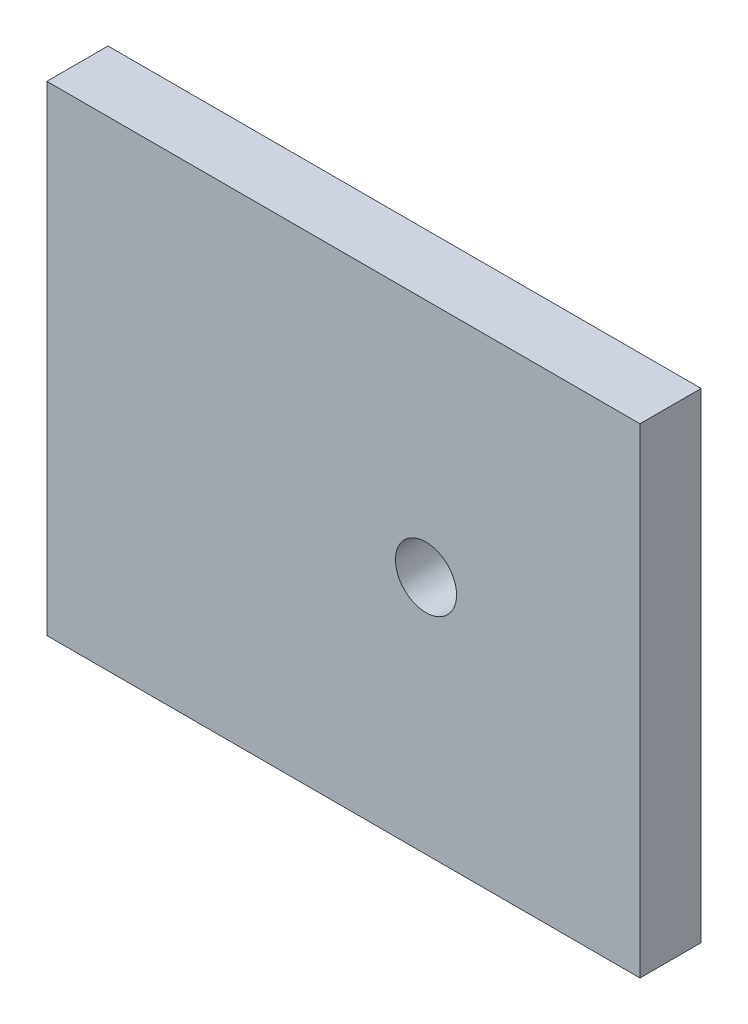
ISO-10303-21;
HEADER;
FILE_DESCRIPTION(('STEP AP214'),'2;1');
FILE_NAME('part.step','',(''),(''),'','','');
FILE_SCHEMA(('AUTOMOTIVE_DESIGN { 1 0 10303 214 1 1 1 1 }'));
ENDSEC;
DATA;
#1=APPLICATION_CONTEXT('core data for automotive mechanical design processes');
#2=APPLICATION_PROTOCOL_DEFINITION('international standard','automotive_design',2000,#1);
#3=PRODUCT_CONTEXT('',#1,'mechanical');
#4=PRODUCT('Part','Part','',(#3));
#5=PRODUCT_RELATED_PRODUCT_CATEGORY('part','',(#4));
#6=PRODUCT_DEFINITION_FORMATION('','',#4);
#7=PRODUCT_DEFINITION_CONTEXT('part definition',#1,'design');
#8=PRODUCT_DEFINITION('design','',#6,#7);
#9=PRODUCT_DEFINITION_SHAPE('','',#8);
#10=(LENGTH_UNIT() NAMED_UNIT(*) SI_UNIT(.MILLI.,.METRE.));
#11=(NAMED_UNIT(*) PLANE_ANGLE_UNIT() SI_UNIT($,.RADIAN.));
#12=(NAMED_UNIT(*) SI_UNIT($,.STERADIAN.) SOLID_ANGLE_UNIT());
#13=UNCERTAINTY_MEASURE_WITH_UNIT(LENGTH_MEASURE(1.E-05),#10,'distance_accuracy_value','');
#14=(GEOMETRIC_REPRESENTATION_CONTEXT(3) GLOBAL_UNCERTAINTY_ASSIGNED_CONTEXT((#13)) GLOBAL_UNIT_ASSIGNED_CONTEXT((#10,
#11,#12)) REPRESENTATION_CONTEXT('',''));
#15=CARTESIAN_POINT('',(0.,0.,0.));
#16=DIRECTION('',(0.,0.,1.));
#17=DIRECTION('',(1.,0.,0.));
#18=AXIS2_PLACEMENT_3D('',#15,#16,#17);
#19=CARTESIAN_POINT('',(48.5,-39.25,10.));
#20=DIRECTION('',(-1.,0.,0.));
#21=DIRECTION('',(0.,0.,1.));
#22=AXIS2_PLACEMENT_3D('',#19,#20,#21);
#23=PLANE('',#22);
#24=DIRECTION('',(0.,1.,0.));
#25=VECTOR('',#24,1.);
#26=CARTESIAN_POINT('',(48.5,-39.25,0.));
#27=LINE('',#26,#25);
#28=CARTESIAN_POINT('',(48.5,-39.25,0.));
#29=VERTEX_POINT('',#28);
#30=CARTESIAN_POINT('',(48.5,39.25,0.));
#31=VERTEX_POINT('',#30);
#32=EDGE_CURVE('E107',#29,#31,#27,.T.);
#33=ORIENTED_EDGE('',*,*,#32,.T.);
#34=DIRECTION('',(0.,0.,-1.));
#35=VECTOR('',#34,1.);
#36=CARTESIAN_POINT('',(48.5,39.25,10.));
#37=LINE('',#36,#35);
#38=CARTESIAN_POINT('',(48.5,39.25,10.));
#39=VERTEX_POINT('',#38);
#40=EDGE_CURVE('E11',#39,#31,#37,.T.);
#41=ORIENTED_EDGE('',*,*,#40,.F.);
#42=DIRECTION('',(0.,1.,0.));
#43=VECTOR('',#42,1.);
#44=CARTESIAN_POINT('',(48.5,-39.25,10.));
#45=LINE('',#44,#43);
#46=CARTESIAN_POINT('',(48.5,-39.25,10.));
#47=VERTEX_POINT('',#46);
#48=EDGE_CURVE('E91',#47,#39,#45,.T.);
#49=ORIENTED_EDGE('',*,*,#48,.F.);
#50=DIRECTION('',(0.,0.,-1.));
#51=VECTOR('',#50,1.);
#52=CARTESIAN_POINT('',(48.5,-39.25,10.));
#53=LINE('',#52,#51);
#54=EDGE_CURVE('E103',#47,#29,#53,.T.);
#55=ORIENTED_EDGE('',*,*,#54,.T.);
#56=EDGE_LOOP('',(#33,#41,#49,#55));
#57=FACE_BOUND('',#56,.T.);
#58=ADVANCED_FACE('F39',(#57),#23,.F.);
#59=CARTESIAN_POINT('',(-48.5,39.25,10.));
#60=DIRECTION('',(0.,-1.,0.));
#61=DIRECTION('',(0.,0.,-1.));
#62=AXIS2_PLACEMENT_3D('',#59,#60,#61);
#63=PLANE('',#62);
#64=DIRECTION('',(-1.,0.,0.));
#65=VECTOR('',#64,1.);
#66=CARTESIAN_POINT('',(-48.5,39.25,0.));
#67=LINE('',#66,#65);
#68=CARTESIAN_POINT('',(-48.5,39.25,0.));
#69=VERTEX_POINT('',#68);
#70=EDGE_CURVE('E96',#31,#69,#67,.T.);
#71=ORIENTED_EDGE('',*,*,#70,.T.);
#72=DIRECTION('',(0.,0.,-1.));
#73=VECTOR('',#72,1.);
#74=CARTESIAN_POINT('',(-48.5,39.25,10.));
#75=LINE('',#74,#73);
#76=CARTESIAN_POINT('',(-48.5,39.25,10.));
#77=VERTEX_POINT('',#76);
#78=EDGE_CURVE('E48',#77,#69,#75,.T.);
#79=ORIENTED_EDGE('',*,*,#78,.F.);
#80=DIRECTION('',(-1.,0.,0.));
#81=VECTOR('',#80,1.);
#82=CARTESIAN_POINT('',(-48.5,39.25,10.));
#83=LINE('',#82,#81);
#84=EDGE_CURVE('E86',#39,#77,#83,.T.);
#85=ORIENTED_EDGE('',*,*,#84,.F.);
#86=ORIENTED_EDGE('',*,*,#40,.T.);
#87=EDGE_LOOP('',(#71,#79,#85,#86));
#88=FACE_BOUND('',#87,.T.);
#89=ADVANCED_FACE('F95',(#88),#63,.F.);
#90=CARTESIAN_POINT('',(-48.5,-39.25,10.));
#91=DIRECTION('',(1.,0.,0.));
#92=DIRECTION('',(0.,0.,-1.));
#93=AXIS2_PLACEMENT_3D('',#90,#91,#92);
#94=PLANE('',#93);
#95=DIRECTION('',(0.,-1.,0.));
#96=VECTOR('',#95,1.);
#97=CARTESIAN_POINT('',(-48.5,-39.25,0.));
#98=LINE('',#97,#96);
#99=CARTESIAN_POINT('',(-48.5,-39.25,0.));
#100=VERTEX_POINT('',#99);
#101=EDGE_CURVE('E73',#69,#100,#98,.T.);
#102=ORIENTED_EDGE('',*,*,#101,.T.);
#103=DIRECTION('',(0.,0.,-1.));
#104=VECTOR('',#103,1.);
#105=CARTESIAN_POINT('',(-48.5,-39.25,10.));
#106=LINE('',#105,#104);
#107=CARTESIAN_POINT('',(-48.5,-39.25,10.));
#108=VERTEX_POINT('',#107);
#109=EDGE_CURVE('E98',#108,#100,#106,.T.);
#110=ORIENTED_EDGE('',*,*,#109,.F.);
#111=DIRECTION('',(0.,-1.,0.));
#112=VECTOR('',#111,1.);
#113=CARTESIAN_POINT('',(-48.5,-39.25,10.));
#114=LINE('',#113,#112);
#115=EDGE_CURVE('E89',#77,#108,#114,.T.);
#116=ORIENTED_EDGE('',*,*,#115,.F.);
#117=ORIENTED_EDGE('',*,*,#78,.T.);
#118=EDGE_LOOP('',(#102,#110,#116,#117));
#119=FACE_BOUND('',#118,.T.);
#120=ADVANCED_FACE('F99',(#119),#94,.F.);
#121=CARTESIAN_POINT('',(-48.5,-39.25,10.));
#122=DIRECTION('',(0.,1.,0.));
#123=DIRECTION('',(0.,0.,1.));
#124=AXIS2_PLACEMENT_3D('',#121,#122,#123);
#125=PLANE('',#124);
#126=DIRECTION('',(1.,0.,0.));
#127=VECTOR('',#126,1.);
#128=CARTESIAN_POINT('',(-48.5,-39.25,0.));
#129=LINE('',#128,#127);
#130=EDGE_CURVE('E79',#100,#29,#129,.T.);
#131=ORIENTED_EDGE('',*,*,#130,.T.);
#132=ORIENTED_EDGE('',*,*,#54,.F.);
#133=DIRECTION('',(1.,0.,0.));
#134=VECTOR('',#133,1.);
#135=CARTESIAN_POINT('',(-48.5,-39.25,10.));
#136=LINE('',#135,#134);
#137=EDGE_CURVE('E56',#108,#47,#136,.T.);
#138=ORIENTED_EDGE('',*,*,#137,.F.);
#139=ORIENTED_EDGE('',*,*,#109,.T.);
#140=EDGE_LOOP('',(#131,#132,#138,#139));
#141=FACE_BOUND('',#140,.T.);
#142=ADVANCED_FACE('F121',(#141),#125,.F.);
#143=CARTESIAN_POINT('',(0.,0.,10.));
#144=DIRECTION('',(0.,0.,-1.));
#145=DIRECTION('',(-1.,0.,0.));
#146=AXIS2_PLACEMENT_3D('',#143,#144,#145);
#147=PLANE('',#146);
#148=CARTESIAN_POINT('',(13.5,0.,10.));
#149=DIRECTION('',(0.,0.,1.));
#150=DIRECTION('',(1.,0.,0.));
#151=AXIS2_PLACEMENT_3D('',#148,#149,#150);
#152=CIRCLE('',#151,5.);
#153=CARTESIAN_POINT('',(18.5,0.,10.));
#154=VERTEX_POINT('',#153);
#155=EDGE_CURVE('E111',#154,#154,#152,.T.);
#156=ORIENTED_EDGE('',*,*,#155,.F.);
#157=EDGE_LOOP('',(#156));
#158=FACE_BOUND('',#157,.T.);
#159=ORIENTED_EDGE('',*,*,#48,.T.);
#160=ORIENTED_EDGE('',*,*,#84,.T.);
#161=ORIENTED_EDGE('',*,*,#115,.T.);
#162=ORIENTED_EDGE('',*,*,#137,.T.);
#163=EDGE_LOOP('',(#159,#160,#161,#162));
#164=FACE_BOUND('',#163,.T.);
#165=ADVANCED_FACE('F87',(#158,#164),#147,.F.);
#166=CARTESIAN_POINT('',(0.,0.,0.));
#167=DIRECTION('',(0.,0.,-1.));
#168=DIRECTION('',(-1.,0.,0.));
#169=AXIS2_PLACEMENT_3D('',#166,#167,#168);
#170=PLANE('',#169);
#171=CARTESIAN_POINT('',(-24.25,0.,0.));
#172=DIRECTION('',(0.,0.,-1.));
#173=DIRECTION('',(-1.,0.,0.));
#174=AXIS2_PLACEMENT_3D('',#171,#172,#173);
#175=CIRCLE('',#174,11.);
#176=CARTESIAN_POINT('',(-35.25,0.,0.));
#177=VERTEX_POINT('',#176);
#178=EDGE_CURVE('E136',#177,#177,#175,.T.);
#179=ORIENTED_EDGE('',*,*,#178,.F.);
#180=EDGE_LOOP('',(#179));
#181=FACE_BOUND('',#180,.T.);
#182=CARTESIAN_POINT('',(13.5,0.,0.));
#183=DIRECTION('',(0.,0.,-1.));
#184=DIRECTION('',(-1.,0.,0.));
#185=AXIS2_PLACEMENT_3D('',#182,#183,#184);
#186=CIRCLE('',#185,5.);
#187=CARTESIAN_POINT('',(8.5,0.,0.));
#188=VERTEX_POINT('',#187);
#189=EDGE_CURVE('E128',#188,#188,#186,.F.);
#190=ORIENTED_EDGE('',*,*,#189,.T.);
#191=EDGE_LOOP('',(#190));
#192=FACE_BOUND('',#191,.T.);
#193=ORIENTED_EDGE('',*,*,#32,.F.);
#194=ORIENTED_EDGE('',*,*,#130,.F.);
#195=ORIENTED_EDGE('',*,*,#101,.F.);
#196=ORIENTED_EDGE('',*,*,#70,.F.);
#197=EDGE_LOOP('',(#193,#194,#195,#196));
#198=FACE_BOUND('',#197,.T.);
#199=ADVANCED_FACE('F124',(#181,#192,#198),#170,.T.);
#200=CARTESIAN_POINT('',(13.5,0.,-0.000999999999999265));
#201=DIRECTION('',(0.,0.,1.));
#202=DIRECTION('',(1.,0.,0.));
#203=AXIS2_PLACEMENT_3D('',#200,#201,#202);
#204=CYLINDRICAL_SURFACE('',#203,5.);
#205=ORIENTED_EDGE('',*,*,#189,.F.);
#206=EDGE_LOOP('',(#205));
#207=FACE_BOUND('',#206,.T.);
#208=ORIENTED_EDGE('',*,*,#155,.T.);
#209=EDGE_LOOP('',(#208));
#210=FACE_BOUND('',#209,.T.);
#211=ADVANCED_FACE('F149',(#207,#210),#204,.F.);
#212=CARTESIAN_POINT('',(-24.25,0.,5.));
#213=DIRECTION('',(0.,0.,-1.));
#214=DIRECTION('',(-1.,0.,0.));
#215=AXIS2_PLACEMENT_3D('',#212,#213,#214);
#216=CYLINDRICAL_SURFACE('',#215,11.);
#217=CARTESIAN_POINT('',(-24.25,0.,5.));
#218=DIRECTION('',(0.,0.,-1.));
#219=DIRECTION('',(-1.,0.,0.));
#220=AXIS2_PLACEMENT_3D('',#217,#218,#219);
#221=CIRCLE('',#220,11.);
#222=CARTESIAN_POINT('',(-35.25,0.,5.));
#223=VERTEX_POINT('',#222);
#224=EDGE_CURVE('E132',#223,#223,#221,.T.);
#225=ORIENTED_EDGE('',*,*,#224,.F.);
#226=EDGE_LOOP('',(#225));
#227=FACE_BOUND('',#226,.T.);
#228=ORIENTED_EDGE('',*,*,#178,.T.);
#229=EDGE_LOOP('',(#228));
#230=FACE_BOUND('',#229,.T.);
#231=ADVANCED_FACE('F146',(#227,#230),#216,.F.);
#232=CARTESIAN_POINT('',(-24.25,0.,5.));
#233=DIRECTION('',(0.,0.,-1.));
#234=DIRECTION('',(-1.,0.,0.));
#235=AXIS2_PLACEMENT_3D('',#232,#233,#234);
#236=PLANE('',#235);
#237=ORIENTED_EDGE('',*,*,#224,.T.);
#238=EDGE_LOOP('',(#237));
#239=FACE_BOUND('',#238,.T.);
#240=ADVANCED_FACE('F144',(#239),#236,.T.);
#241=CLOSED_SHELL('',(#58,#89,#120,#142,#165,#199,#211,#231,#240));
#242=MANIFOLD_SOLID_BREP('B2',#241);
#243=ADVANCED_BREP_SHAPE_REPRESENTATION('',(#18,#242),#14);
#244=SHAPE_DEFINITION_REPRESENTATION(#9,#243);
ENDSEC;
END-ISO-10303-21;
